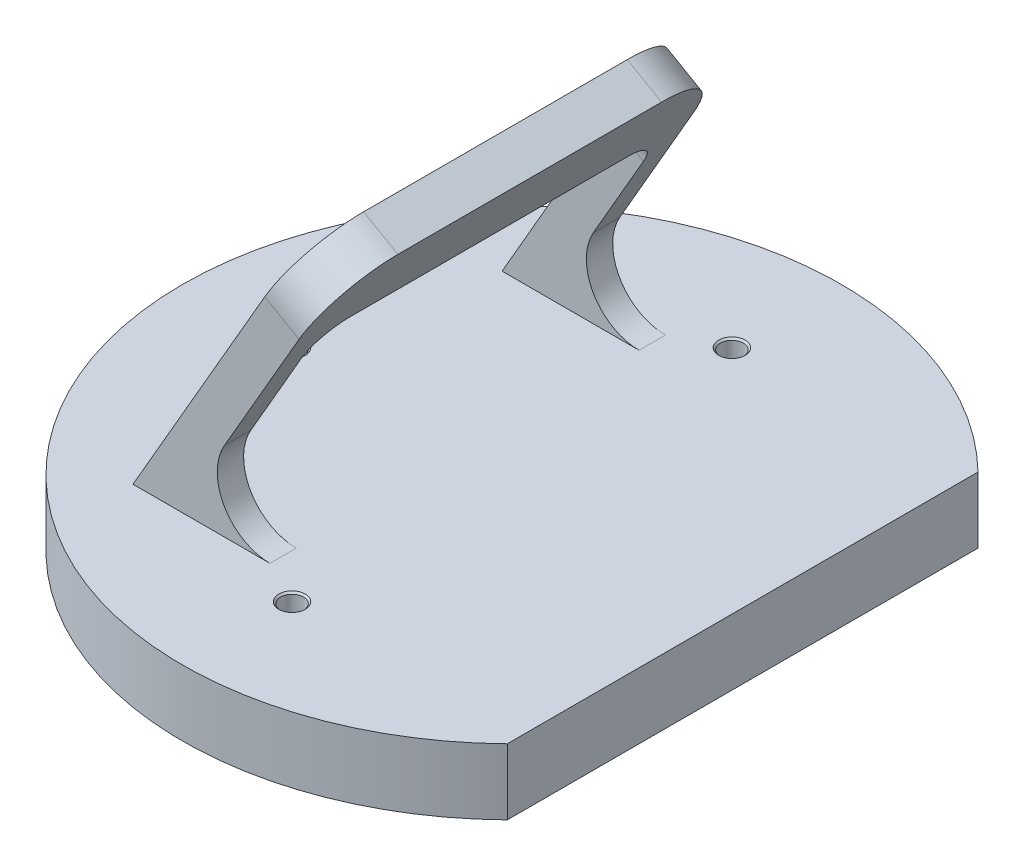
ISO-10303-21;
HEADER;
FILE_DESCRIPTION(('STEP AP214'),'2;1');
FILE_NAME('part.step','',(''),(''),'','','');
FILE_SCHEMA(('AUTOMOTIVE_DESIGN { 1 0 10303 214 1 1 1 1 }'));
ENDSEC;
DATA;
#1=APPLICATION_CONTEXT('core data for automotive mechanical design processes');
#2=APPLICATION_PROTOCOL_DEFINITION('international standard','automotive_design',2000,#1);
#3=PRODUCT_CONTEXT('',#1,'mechanical');
#4=PRODUCT('Part','Part','',(#3));
#5=PRODUCT_RELATED_PRODUCT_CATEGORY('part','',(#4));
#6=PRODUCT_DEFINITION_FORMATION('','',#4);
#7=PRODUCT_DEFINITION_CONTEXT('part definition',#1,'design');
#8=PRODUCT_DEFINITION('design','',#6,#7);
#9=PRODUCT_DEFINITION_SHAPE('','',#8);
#10=(LENGTH_UNIT() NAMED_UNIT(*) SI_UNIT(.MILLI.,.METRE.));
#11=(NAMED_UNIT(*) PLANE_ANGLE_UNIT() SI_UNIT($,.RADIAN.));
#12=(NAMED_UNIT(*) SI_UNIT($,.STERADIAN.) SOLID_ANGLE_UNIT());
#13=UNCERTAINTY_MEASURE_WITH_UNIT(LENGTH_MEASURE(1.E-05),#10,'distance_accuracy_value','');
#14=(GEOMETRIC_REPRESENTATION_CONTEXT(3) GLOBAL_UNCERTAINTY_ASSIGNED_CONTEXT((#13)) GLOBAL_UNIT_ASSIGNED_CONTEXT((#10,
#11,#12)) REPRESENTATION_CONTEXT('',''));
#15=CARTESIAN_POINT('',(0.,0.,0.));
#16=DIRECTION('',(0.,0.,1.));
#17=DIRECTION('',(1.,0.,0.));
#18=AXIS2_PLACEMENT_3D('',#15,#16,#17);
#19=CARTESIAN_POINT('',(-13.4307806183468,36.,60.));
#20=DIRECTION('',(0.,0.,-1.));
#21=DIRECTION('',(-1.,0.,0.));
#22=AXIS2_PLACEMENT_3D('',#19,#20,#21);
#23=CYLINDRICAL_SURFACE('',#22,16.);
#24=DIRECTION('',(0.,0.,-1.));
#25=VECTOR('',#24,1.);
#26=CARTESIAN_POINT('',(-27.2871870788977,44.0000000000001,60.));
#27=LINE('',#26,#25);
#28=CARTESIAN_POINT('',(-27.2871870788977,44.0000000000001,60.));
#29=VERTEX_POINT('',#28);
#30=CARTESIAN_POINT('',(-27.2871870788977,44.0000000000001,52.));
#31=VERTEX_POINT('',#30);
#32=EDGE_CURVE('E259',#29,#31,#27,.T.);
#33=ORIENTED_EDGE('',*,*,#32,.F.);
#34=CARTESIAN_POINT('',(-13.4307806183468,36.,60.));
#35=DIRECTION('',(0.,0.,-1.));
#36=DIRECTION('',(-1.,0.,0.));
#37=AXIS2_PLACEMENT_3D('',#34,#35,#36);
#38=CIRCLE('',#37,16.);
#39=CARTESIAN_POINT('',(-13.4307806183468,20.,60.));
#40=VERTEX_POINT('',#39);
#41=EDGE_CURVE('E50',#29,#40,#38,.F.);
#42=ORIENTED_EDGE('',*,*,#41,.T.);
#43=DIRECTION('',(0.,0.,-1.));
#44=VECTOR('',#43,1.);
#45=CARTESIAN_POINT('',(-13.4307806183468,20.,0.));
#46=LINE('',#45,#44);
#47=CARTESIAN_POINT('',(-13.4307806183468,20.,52.));
#48=VERTEX_POINT('',#47);
#49=EDGE_CURVE('E262',#48,#40,#46,.F.);
#50=ORIENTED_EDGE('',*,*,#49,.F.);
#51=CARTESIAN_POINT('',(-13.4307806183468,36.,52.));
#52=DIRECTION('',(0.,0.,1.));
#53=DIRECTION('',(1.,0.,0.));
#54=AXIS2_PLACEMENT_3D('',#51,#52,#53);
#55=CIRCLE('',#54,16.);
#56=EDGE_CURVE('E11',#48,#31,#55,.F.);
#57=ORIENTED_EDGE('',*,*,#56,.T.);
#58=EDGE_LOOP('',(#33,#42,#50,#57));
#59=FACE_BOUND('',#58,.T.);
#60=ADVANCED_FACE('F43',(#59),#23,.F.);
#61=CARTESIAN_POINT('',(-13.4307806183468,36.,60.));
#62=DIRECTION('',(0.,0.,-1.));
#63=DIRECTION('',(-1.,0.,0.));
#64=AXIS2_PLACEMENT_3D('',#61,#62,#63);
#65=CYLINDRICAL_SURFACE('',#64,16.);
#66=DIRECTION('',(0.,0.,-1.));
#67=VECTOR('',#66,1.);
#68=CARTESIAN_POINT('',(-27.2871870788977,44.0000000000001,60.));
#69=LINE('',#68,#67);
#70=CARTESIAN_POINT('',(-27.2871870788977,44.0000000000001,-52.));
#71=VERTEX_POINT('',#70);
#72=CARTESIAN_POINT('',(-27.2871870788977,44.0000000000001,-60.));
#73=VERTEX_POINT('',#72);
#74=EDGE_CURVE('E251',#71,#73,#69,.T.);
#75=ORIENTED_EDGE('',*,*,#74,.F.);
#76=CARTESIAN_POINT('',(-13.4307806183468,36.,-52.));
#77=DIRECTION('',(0.,0.,1.));
#78=DIRECTION('',(1.,0.,0.));
#79=AXIS2_PLACEMENT_3D('',#76,#77,#78);
#80=CIRCLE('',#79,16.);
#81=CARTESIAN_POINT('',(-13.4307806183468,20.,-52.));
#82=VERTEX_POINT('',#81);
#83=EDGE_CURVE('E255',#71,#82,#80,.T.);
#84=ORIENTED_EDGE('',*,*,#83,.T.);
#85=DIRECTION('',(0.,0.,-1.));
#86=VECTOR('',#85,1.);
#87=CARTESIAN_POINT('',(-13.4307806183468,20.,0.));
#88=LINE('',#87,#86);
#89=CARTESIAN_POINT('',(-13.4307806183468,20.,-60.));
#90=VERTEX_POINT('',#89);
#91=EDGE_CURVE('E173',#90,#82,#88,.F.);
#92=ORIENTED_EDGE('',*,*,#91,.F.);
#93=CARTESIAN_POINT('',(-13.4307806183468,36.,-60.));
#94=DIRECTION('',(0.,0.,-1.));
#95=DIRECTION('',(-1.,0.,0.));
#96=AXIS2_PLACEMENT_3D('',#93,#94,#95);
#97=CIRCLE('',#96,16.);
#98=EDGE_CURVE('E257',#90,#73,#97,.T.);
#99=ORIENTED_EDGE('',*,*,#98,.T.);
#100=EDGE_LOOP('',(#75,#84,#92,#99));
#101=FACE_BOUND('',#100,.T.);
#102=ADVANCED_FACE('F363',(#101),#65,.F.);
#103=CARTESIAN_POINT('',(-44.6076951545868,14.,60.));
#104=DIRECTION('',(-0.866025403784436,0.500000000000004,0.));
#105=DIRECTION('',(-0.500000000000004,-0.866025403784436,0.));
#106=AXIS2_PLACEMENT_3D('',#103,#104,#105);
#107=PLANE('',#106);
#108=DIRECTION('',(0.500000000000004,0.866025403784436,0.));
#109=VECTOR('',#108,1.);
#110=CARTESIAN_POINT('',(-44.6076951545868,14.,60.));
#111=LINE('',#110,#109);
#112=CARTESIAN_POINT('',(-4.60769515458641,83.2820323027549,60.));
#113=VERTEX_POINT('',#112);
#114=EDGE_CURVE('E186',#29,#113,#111,.T.);
#115=ORIENTED_EDGE('',*,*,#114,.F.);
#116=ORIENTED_EDGE('',*,*,#32,.T.);
#117=DIRECTION('',(0.500000000000004,0.866025403784436,0.));
#118=VECTOR('',#117,1.);
#119=CARTESIAN_POINT('',(-41.143593539449,20.,52.));
#120=LINE('',#119,#118);
#121=CARTESIAN_POINT('',(-12.1076951545865,70.2916512459883,52.));
#122=VERTEX_POINT('',#121);
#123=EDGE_CURVE('E165',#31,#122,#120,.T.);
#124=ORIENTED_EDGE('',*,*,#123,.T.);
#125=CARTESIAN_POINT('',(-12.1076951545865,70.2916512459883,42.));
#126=DIRECTION('',(-0.866025403784436,0.500000000000004,0.));
#127=DIRECTION('',(-0.500000000000004,-0.866025403784436,0.));
#128=AXIS2_PLACEMENT_3D('',#125,#126,#127);
#129=CIRCLE('',#128,10.);
#130=CARTESIAN_POINT('',(-7.10769515458647,78.9519052838327,42.));
#131=VERTEX_POINT('',#130);
#132=EDGE_CURVE('E244',#122,#131,#129,.T.);
#133=ORIENTED_EDGE('',*,*,#132,.T.);
#134=DIRECTION('',(0.,0.,1.));
#135=VECTOR('',#134,1.);
#136=CARTESIAN_POINT('',(-7.10769515458647,78.9519052838327,-52.));
#137=LINE('',#136,#135);
#138=CARTESIAN_POINT('',(-7.10769515458647,78.9519052838327,-42.));
#139=VERTEX_POINT('',#138);
#140=EDGE_CURVE('E296',#139,#131,#137,.T.);
#141=ORIENTED_EDGE('',*,*,#140,.F.);
#142=CARTESIAN_POINT('',(-12.1076951545865,70.2916512459883,-42.));
#143=DIRECTION('',(-0.866025403784436,0.500000000000004,0.));
#144=DIRECTION('',(-0.500000000000004,-0.866025403784436,0.));
#145=AXIS2_PLACEMENT_3D('',#142,#143,#144);
#146=CIRCLE('',#145,10.);
#147=CARTESIAN_POINT('',(-12.1076951545865,70.2916512459883,-52.));
#148=VERTEX_POINT('',#147);
#149=EDGE_CURVE('E248',#139,#148,#146,.T.);
#150=ORIENTED_EDGE('',*,*,#149,.T.);
#151=DIRECTION('',(0.500000000000004,0.866025403784436,0.));
#152=VECTOR('',#151,1.);
#153=CARTESIAN_POINT('',(-41.143593539449,20.,-52.));
#154=LINE('',#153,#152);
#155=EDGE_CURVE('E174',#71,#148,#154,.T.);
#156=ORIENTED_EDGE('',*,*,#155,.F.);
#157=ORIENTED_EDGE('',*,*,#74,.T.);
#158=DIRECTION('',(0.500000000000004,0.866025403784436,0.));
#159=VECTOR('',#158,1.);
#160=CARTESIAN_POINT('',(-44.6076951545868,14.,-60.));
#161=LINE('',#160,#159);
#162=CARTESIAN_POINT('',(-4.6076951545864,83.2820323027549,-60.));
#163=VERTEX_POINT('',#162);
#164=EDGE_CURVE('E291',#73,#163,#161,.T.);
#165=ORIENTED_EDGE('',*,*,#164,.T.);
#166=CARTESIAN_POINT('',(-4.60769515458642,83.2820323027549,-40.));
#167=DIRECTION('',(-0.866025403784436,0.500000000000004,0.));
#168=DIRECTION('',(-0.500000000000004,-0.866025403784436,0.));
#169=AXIS2_PLACEMENT_3D('',#166,#167,#168);
#170=CIRCLE('',#169,20.);
#171=CARTESIAN_POINT('',(5.39230484541366,100.602540378444,-40.));
#172=VERTEX_POINT('',#171);
#173=EDGE_CURVE('E220',#163,#172,#170,.F.);
#174=ORIENTED_EDGE('',*,*,#173,.T.);
#175=DIRECTION('',(0.,0.,-1.));
#176=VECTOR('',#175,1.);
#177=CARTESIAN_POINT('',(5.39230484541366,100.602540378444,60.));
#178=LINE('',#177,#176);
#179=CARTESIAN_POINT('',(5.39230484541366,100.602540378444,40.));
#180=VERTEX_POINT('',#179);
#181=EDGE_CURVE('E192',#180,#172,#178,.T.);
#182=ORIENTED_EDGE('',*,*,#181,.F.);
#183=CARTESIAN_POINT('',(-4.60769515458642,83.2820323027549,40.));
#184=DIRECTION('',(-0.866025403784436,0.500000000000004,0.));
#185=DIRECTION('',(-0.500000000000004,-0.866025403784436,0.));
#186=AXIS2_PLACEMENT_3D('',#183,#184,#185);
#187=CIRCLE('',#186,20.);
#188=EDGE_CURVE('E217',#180,#113,#187,.F.);
#189=ORIENTED_EDGE('',*,*,#188,.T.);
#190=EDGE_LOOP('',(#115,#116,#124,#133,#141,#150,#156,#157,#165,#174,#182,#189));
#191=FACE_BOUND('',#190,.T.);
#192=ADVANCED_FACE('F369',(#191),#107,.F.);
#193=CARTESIAN_POINT('',(-55.,20.,60.));
#194=DIRECTION('',(-0.866025403784436,0.500000000000004,0.));
#195=DIRECTION('',(-0.500000000000004,-0.866025403784436,0.));
#196=AXIS2_PLACEMENT_3D('',#193,#194,#195);
#197=PLANE('',#196);
#198=DIRECTION('',(0.,0.,-1.));
#199=VECTOR('',#198,1.);
#200=CARTESIAN_POINT('',(-4.99999999999959,106.602540378444,60.));
#201=LINE('',#200,#199);
#202=CARTESIAN_POINT('',(-4.99999999999959,106.602540378444,40.));
#203=VERTEX_POINT('',#202);
#204=CARTESIAN_POINT('',(-4.99999999999959,106.602540378444,-40.));
#205=VERTEX_POINT('',#204);
#206=EDGE_CURVE('E184',#203,#205,#201,.T.);
#207=ORIENTED_EDGE('',*,*,#206,.T.);
#208=CARTESIAN_POINT('',(-14.9999999999997,89.2820323027549,-40.));
#209=DIRECTION('',(-0.866025403784436,0.500000000000004,0.));
#210=DIRECTION('',(-0.500000000000004,-0.866025403784436,0.));
#211=AXIS2_PLACEMENT_3D('',#208,#209,#210);
#212=CIRCLE('',#211,20.);
#213=CARTESIAN_POINT('',(-14.9999999999997,89.2820323027549,-60.));
#214=VERTEX_POINT('',#213);
#215=EDGE_CURVE('E229',#205,#214,#212,.T.);
#216=ORIENTED_EDGE('',*,*,#215,.T.);
#217=DIRECTION('',(0.500000000000004,0.866025403784436,0.));
#218=VECTOR('',#217,1.);
#219=CARTESIAN_POINT('',(-55.,20.,-60.));
#220=LINE('',#219,#218);
#221=CARTESIAN_POINT('',(-55.,20.,-60.));
#222=VERTEX_POINT('',#221);
#223=EDGE_CURVE('E180',#222,#214,#220,.T.);
#224=ORIENTED_EDGE('',*,*,#223,.F.);
#225=DIRECTION('',(0.,0.,-1.));
#226=VECTOR('',#225,1.);
#227=CARTESIAN_POINT('',(-55.,20.,60.));
#228=LINE('',#227,#226);
#229=CARTESIAN_POINT('',(-55.,20.,-52.));
#230=VERTEX_POINT('',#229);
#231=EDGE_CURVE('E170',#230,#222,#228,.T.);
#232=ORIENTED_EDGE('',*,*,#231,.F.);
#233=DIRECTION('',(-0.500000000000004,-0.866025403784436,0.));
#234=VECTOR('',#233,1.);
#235=CARTESIAN_POINT('',(-17.4999999999997,84.9519052838327,-52.));
#236=LINE('',#235,#234);
#237=CARTESIAN_POINT('',(-22.4999999999997,76.2916512459884,-52.));
#238=VERTEX_POINT('',#237);
#239=EDGE_CURVE('E156',#238,#230,#236,.T.);
#240=ORIENTED_EDGE('',*,*,#239,.F.);
#241=CARTESIAN_POINT('',(-22.4999999999997,76.2916512459884,-42.));
#242=DIRECTION('',(-0.866025403784436,0.500000000000004,0.));
#243=DIRECTION('',(-0.500000000000004,-0.866025403784436,0.));
#244=AXIS2_PLACEMENT_3D('',#241,#242,#243);
#245=CIRCLE('',#244,10.);
#246=CARTESIAN_POINT('',(-17.4999999999997,84.9519052838327,-42.));
#247=VERTEX_POINT('',#246);
#248=EDGE_CURVE('E246',#238,#247,#245,.F.);
#249=ORIENTED_EDGE('',*,*,#248,.T.);
#250=DIRECTION('',(0.,0.,1.));
#251=VECTOR('',#250,1.);
#252=CARTESIAN_POINT('',(-17.4999999999997,84.9519052838327,-52.));
#253=LINE('',#252,#251);
#254=CARTESIAN_POINT('',(-17.4999999999997,84.9519052838327,42.));
#255=VERTEX_POINT('',#254);
#256=EDGE_CURVE('E293',#247,#255,#253,.T.);
#257=ORIENTED_EDGE('',*,*,#256,.T.);
#258=CARTESIAN_POINT('',(-22.4999999999997,76.2916512459884,42.));
#259=DIRECTION('',(-0.866025403784436,0.500000000000004,0.));
#260=DIRECTION('',(-0.500000000000004,-0.866025403784436,0.));
#261=AXIS2_PLACEMENT_3D('',#258,#259,#260);
#262=CIRCLE('',#261,10.);
#263=CARTESIAN_POINT('',(-22.4999999999997,76.2916512459884,52.));
#264=VERTEX_POINT('',#263);
#265=EDGE_CURVE('E242',#255,#264,#262,.F.);
#266=ORIENTED_EDGE('',*,*,#265,.T.);
#267=DIRECTION('',(-0.500000000000004,-0.866025403784436,0.));
#268=VECTOR('',#267,1.);
#269=CARTESIAN_POINT('',(-17.4999999999997,84.9519052838327,52.));
#270=LINE('',#269,#268);
#271=CARTESIAN_POINT('',(-55.,20.,52.));
#272=VERTEX_POINT('',#271);
#273=EDGE_CURVE('E271',#264,#272,#270,.T.);
#274=ORIENTED_EDGE('',*,*,#273,.T.);
#275=CARTESIAN_POINT('',(-55.,20.,60.));
#276=VERTEX_POINT('',#275);
#277=EDGE_CURVE('E181',#276,#272,#228,.T.);
#278=ORIENTED_EDGE('',*,*,#277,.F.);
#279=DIRECTION('',(0.500000000000004,0.866025403784436,0.));
#280=VECTOR('',#279,1.);
#281=CARTESIAN_POINT('',(-55.,20.,60.));
#282=LINE('',#281,#280);
#283=CARTESIAN_POINT('',(-14.9999999999997,89.2820323027549,60.));
#284=VERTEX_POINT('',#283);
#285=EDGE_CURVE('E182',#276,#284,#282,.T.);
#286=ORIENTED_EDGE('',*,*,#285,.T.);
#287=CARTESIAN_POINT('',(-14.9999999999997,89.2820323027549,40.));
#288=DIRECTION('',(-0.866025403784436,0.500000000000004,0.));
#289=DIRECTION('',(-0.500000000000004,-0.866025403784436,0.));
#290=AXIS2_PLACEMENT_3D('',#287,#288,#289);
#291=CIRCLE('',#290,20.);
#292=EDGE_CURVE('E227',#284,#203,#291,.T.);
#293=ORIENTED_EDGE('',*,*,#292,.T.);
#294=EDGE_LOOP('',(#207,#216,#224,#232,#240,#249,#257,#266,#274,#278,#286,#293));
#295=FACE_BOUND('',#294,.T.);
#296=ADVANCED_FACE('F178',(#295),#197,.T.);
#297=CARTESIAN_POINT('',(0.,20.,0.));
#298=DIRECTION('',(0.,1.,0.));
#299=DIRECTION('',(0.,0.,1.));
#300=AXIS2_PLACEMENT_3D('',#297,#298,#299);
#301=PLANE('',#300);
#302=CARTESIAN_POINT('',(0.,20.,-66.737936963143));
#303=DIRECTION('',(0.,1.,0.));
#304=DIRECTION('',(0.,0.,1.));
#305=AXIS2_PLACEMENT_3D('',#302,#303,#304);
#306=CIRCLE('',#305,4.025);
#307=CARTESIAN_POINT('',(0.,20.,-62.712936963143));
#308=VERTEX_POINT('',#307);
#309=EDGE_CURVE('E329',#308,#308,#306,.T.);
#310=ORIENTED_EDGE('',*,*,#309,.F.);
#311=EDGE_LOOP('',(#310));
#312=FACE_BOUND('',#311,.T.);
#313=CARTESIAN_POINT('',(0.,20.,66.737936963143));
#314=DIRECTION('',(0.,1.,0.));
#315=DIRECTION('',(0.,0.,1.));
#316=AXIS2_PLACEMENT_3D('',#313,#314,#315);
#317=CIRCLE('',#316,4.025);
#318=CARTESIAN_POINT('',(0.,20.,70.7629369631429));
#319=VERTEX_POINT('',#318);
#320=EDGE_CURVE('E320',#319,#319,#317,.T.);
#321=ORIENTED_EDGE('',*,*,#320,.F.);
#322=EDGE_LOOP('',(#321));
#323=FACE_BOUND('',#322,.T.);
#324=CARTESIAN_POINT('',(-66.737936963143,20.,0.));
#325=DIRECTION('',(0.,1.,0.));
#326=DIRECTION('',(0.,0.,1.));
#327=AXIS2_PLACEMENT_3D('',#324,#325,#326);
#328=CIRCLE('',#327,4.025);
#329=CARTESIAN_POINT('',(-66.737936963143,20.,4.025));
#330=VERTEX_POINT('',#329);
#331=EDGE_CURVE('E311',#330,#330,#328,.T.);
#332=ORIENTED_EDGE('',*,*,#331,.F.);
#333=EDGE_LOOP('',(#332));
#334=FACE_BOUND('',#333,.T.);
#335=ORIENTED_EDGE('',*,*,#49,.T.);
#336=DIRECTION('',(-1.,0.,0.));
#337=VECTOR('',#336,1.);
#338=CARTESIAN_POINT('',(0.,20.,60.));
#339=LINE('',#338,#337);
#340=EDGE_CURVE('E57',#40,#276,#339,.T.);
#341=ORIENTED_EDGE('',*,*,#340,.T.);
#342=ORIENTED_EDGE('',*,*,#277,.T.);
#343=DIRECTION('',(1.,0.,0.));
#344=VECTOR('',#343,1.);
#345=CARTESIAN_POINT('',(-55.,20.,52.));
#346=LINE('',#345,#344);
#347=EDGE_CURVE('E65',#272,#48,#346,.T.);
#348=ORIENTED_EDGE('',*,*,#347,.T.);
#349=EDGE_LOOP('',(#335,#341,#342,#348));
#350=FACE_BOUND('',#349,.T.);
#351=CARTESIAN_POINT('',(0.,20.,0.));
#352=DIRECTION('',(0.,1.,0.));
#353=DIRECTION('',(0.,0.,1.));
#354=AXIS2_PLACEMENT_3D('',#351,#352,#353);
#355=CIRCLE('',#354,100.);
#356=CARTESIAN_POINT('',(70.,20.,-71.4142842854285));
#357=VERTEX_POINT('',#356);
#358=CARTESIAN_POINT('',(70.,20.,71.4142842854285));
#359=VERTEX_POINT('',#358);
#360=EDGE_CURVE('E196',#357,#359,#355,.T.);
#361=ORIENTED_EDGE('',*,*,#360,.T.);
#362=DIRECTION('',(0.,0.,-1.));
#363=VECTOR('',#362,1.);
#364=CARTESIAN_POINT('',(70.,20.,-71.4142842854285));
#365=LINE('',#364,#363);
#366=EDGE_CURVE('E199',#359,#357,#365,.T.);
#367=ORIENTED_EDGE('',*,*,#366,.T.);
#368=EDGE_LOOP('',(#361,#367));
#369=FACE_BOUND('',#368,.T.);
#370=ORIENTED_EDGE('',*,*,#91,.T.);
#371=DIRECTION('',(1.,0.,0.));
#372=VECTOR('',#371,1.);
#373=CARTESIAN_POINT('',(-55.,20.,-52.));
#374=LINE('',#373,#372);
#375=EDGE_CURVE('E159',#230,#82,#374,.T.);
#376=ORIENTED_EDGE('',*,*,#375,.F.);
#377=ORIENTED_EDGE('',*,*,#231,.T.);
#378=DIRECTION('',(-1.,0.,0.));
#379=VECTOR('',#378,1.);
#380=CARTESIAN_POINT('',(0.,20.,-60.));
#381=LINE('',#380,#379);
#382=EDGE_CURVE('E211',#90,#222,#381,.T.);
#383=ORIENTED_EDGE('',*,*,#382,.F.);
#384=EDGE_LOOP('',(#370,#376,#377,#383));
#385=FACE_BOUND('',#384,.T.);
#386=ADVANCED_FACE('F169',(#312,#323,#334,#350,#369,#385),#301,.T.);
#387=CARTESIAN_POINT('',(0.,20.,0.));
#388=DIRECTION('',(0.,-1.,0.));
#389=DIRECTION('',(0.,0.,-1.));
#390=AXIS2_PLACEMENT_3D('',#387,#388,#389);
#391=CYLINDRICAL_SURFACE('',#390,100.);
#392=CARTESIAN_POINT('',(0.,0.,0.));
#393=DIRECTION('',(0.,1.,0.));
#394=DIRECTION('',(0.,0.,1.));
#395=AXIS2_PLACEMENT_3D('',#392,#393,#394);
#396=CIRCLE('',#395,100.);
#397=CARTESIAN_POINT('',(70.,0.,-71.4142842854285));
#398=VERTEX_POINT('',#397);
#399=CARTESIAN_POINT('',(70.,0.,71.4142842854285));
#400=VERTEX_POINT('',#399);
#401=EDGE_CURVE('E195',#398,#400,#396,.T.);
#402=ORIENTED_EDGE('',*,*,#401,.T.);
#403=DIRECTION('',(0.,-1.,0.));
#404=VECTOR('',#403,1.);
#405=CARTESIAN_POINT('',(70.,20.,71.4142842854285));
#406=LINE('',#405,#404);
#407=EDGE_CURVE('E208',#359,#400,#406,.T.);
#408=ORIENTED_EDGE('',*,*,#407,.F.);
#409=ORIENTED_EDGE('',*,*,#360,.F.);
#410=DIRECTION('',(0.,-1.,0.));
#411=VECTOR('',#410,1.);
#412=CARTESIAN_POINT('',(70.,20.,-71.4142842854285));
#413=LINE('',#412,#411);
#414=EDGE_CURVE('E202',#357,#398,#413,.T.);
#415=ORIENTED_EDGE('',*,*,#414,.T.);
#416=EDGE_LOOP('',(#402,#408,#409,#415));
#417=FACE_BOUND('',#416,.T.);
#418=ADVANCED_FACE('F337',(#417),#391,.T.);
#419=CARTESIAN_POINT('',(70.,20.,-71.4142842854285));
#420=DIRECTION('',(-1.,0.,0.));
#421=DIRECTION('',(0.,0.,1.));
#422=AXIS2_PLACEMENT_3D('',#419,#420,#421);
#423=PLANE('',#422);
#424=DIRECTION('',(0.,0.,-1.));
#425=VECTOR('',#424,1.);
#426=CARTESIAN_POINT('',(70.,0.,-71.4142842854285));
#427=LINE('',#426,#425);
#428=EDGE_CURVE('E200',#400,#398,#427,.T.);
#429=ORIENTED_EDGE('',*,*,#428,.T.);
#430=ORIENTED_EDGE('',*,*,#414,.F.);
#431=ORIENTED_EDGE('',*,*,#366,.F.);
#432=ORIENTED_EDGE('',*,*,#407,.T.);
#433=EDGE_LOOP('',(#429,#430,#431,#432));
#434=FACE_BOUND('',#433,.T.);
#435=ADVANCED_FACE('F391',(#434),#423,.F.);
#436=CARTESIAN_POINT('',(0.,0.,0.));
#437=DIRECTION('',(0.,1.,0.));
#438=DIRECTION('',(0.,0.,1.));
#439=AXIS2_PLACEMENT_3D('',#436,#437,#438);
#440=PLANE('',#439);
#441=CARTESIAN_POINT('',(0.,0.,-66.737936963143));
#442=DIRECTION('',(0.,1.,0.));
#443=DIRECTION('',(0.,0.,1.));
#444=AXIS2_PLACEMENT_3D('',#441,#442,#443);
#445=CIRCLE('',#444,3.5);
#446=CARTESIAN_POINT('',(0.,0.,-63.2379369631429));
#447=VERTEX_POINT('',#446);
#448=EDGE_CURVE('E323',#447,#447,#445,.T.);
#449=ORIENTED_EDGE('',*,*,#448,.T.);
#450=EDGE_LOOP('',(#449));
#451=FACE_BOUND('',#450,.T.);
#452=CARTESIAN_POINT('',(0.,0.,66.737936963143));
#453=DIRECTION('',(0.,1.,0.));
#454=DIRECTION('',(0.,0.,1.));
#455=AXIS2_PLACEMENT_3D('',#452,#453,#454);
#456=CIRCLE('',#455,3.5);
#457=CARTESIAN_POINT('',(0.,0.,70.237936963143));
#458=VERTEX_POINT('',#457);
#459=EDGE_CURVE('E314',#458,#458,#456,.T.);
#460=ORIENTED_EDGE('',*,*,#459,.T.);
#461=EDGE_LOOP('',(#460));
#462=FACE_BOUND('',#461,.T.);
#463=CARTESIAN_POINT('',(-66.737936963143,0.,0.));
#464=DIRECTION('',(0.,1.,0.));
#465=DIRECTION('',(0.,0.,1.));
#466=AXIS2_PLACEMENT_3D('',#463,#464,#465);
#467=CIRCLE('',#466,3.5);
#468=CARTESIAN_POINT('',(-66.737936963143,0.,3.5));
#469=VERTEX_POINT('',#468);
#470=EDGE_CURVE('E304',#469,#469,#467,.T.);
#471=ORIENTED_EDGE('',*,*,#470,.T.);
#472=EDGE_LOOP('',(#471));
#473=FACE_BOUND('',#472,.T.);
#474=ORIENTED_EDGE('',*,*,#401,.F.);
#475=ORIENTED_EDGE('',*,*,#428,.F.);
#476=EDGE_LOOP('',(#474,#475));
#477=FACE_BOUND('',#476,.T.);
#478=ADVANCED_FACE('F395',(#451,#462,#473,#477),#440,.F.);
#479=CARTESIAN_POINT('',(-4.99999999999959,106.602540378444,60.));
#480=DIRECTION('',(0.500000000000002,0.866025403784438,0.));
#481=DIRECTION('',(-0.866025403784438,0.500000000000002,0.));
#482=AXIS2_PLACEMENT_3D('',#479,#480,#481);
#483=PLANE('',#482);
#484=ORIENTED_EDGE('',*,*,#181,.T.);
#485=DIRECTION('',(0.866025403784438,-0.500000000000002,0.));
#486=VECTOR('',#485,1.);
#487=CARTESIAN_POINT('',(-4.99999999999959,106.602540378444,-40.));
#488=LINE('',#487,#486);
#489=EDGE_CURVE('E225',#172,#205,#488,.F.);
#490=ORIENTED_EDGE('',*,*,#489,.T.);
#491=ORIENTED_EDGE('',*,*,#206,.F.);
#492=DIRECTION('',(0.866025403784438,-0.500000000000002,0.));
#493=VECTOR('',#492,1.);
#494=CARTESIAN_POINT('',(5.39230484541367,100.602540378444,40.));
#495=LINE('',#494,#493);
#496=EDGE_CURVE('E222',#203,#180,#495,.T.);
#497=ORIENTED_EDGE('',*,*,#496,.T.);
#498=EDGE_LOOP('',(#484,#490,#491,#497));
#499=FACE_BOUND('',#498,.T.);
#500=ADVANCED_FACE('F280',(#499),#483,.T.);
#501=CARTESIAN_POINT('',(0.,0.,60.));
#502=DIRECTION('',(0.,0.,-1.));
#503=DIRECTION('',(-1.,0.,0.));
#504=AXIS2_PLACEMENT_3D('',#501,#502,#503);
#505=PLANE('',#504);
#506=ORIENTED_EDGE('',*,*,#340,.F.);
#507=ORIENTED_EDGE('',*,*,#41,.F.);
#508=ORIENTED_EDGE('',*,*,#114,.T.);
#509=DIRECTION('',(0.866025403784438,-0.500000000000002,0.));
#510=VECTOR('',#509,1.);
#511=CARTESIAN_POINT('',(-14.9999999999996,89.2820323027549,60.));
#512=LINE('',#511,#510);
#513=EDGE_CURVE('E231',#113,#284,#512,.F.);
#514=ORIENTED_EDGE('',*,*,#513,.T.);
#515=ORIENTED_EDGE('',*,*,#285,.F.);
#516=EDGE_LOOP('',(#506,#507,#508,#514,#515));
#517=FACE_BOUND('',#516,.T.);
#518=ADVANCED_FACE('F272',(#517),#505,.F.);
#519=CARTESIAN_POINT('',(0.,0.,-60.));
#520=DIRECTION('',(0.,0.,-1.));
#521=DIRECTION('',(-1.,0.,0.));
#522=AXIS2_PLACEMENT_3D('',#519,#520,#521);
#523=PLANE('',#522);
#524=ORIENTED_EDGE('',*,*,#223,.T.);
#525=DIRECTION('',(0.866025403784438,-0.500000000000002,0.));
#526=VECTOR('',#525,1.);
#527=CARTESIAN_POINT('',(34.9102540378445,60.4663336986829,-60.));
#528=LINE('',#527,#526);
#529=EDGE_CURVE('E214',#214,#163,#528,.T.);
#530=ORIENTED_EDGE('',*,*,#529,.T.);
#531=ORIENTED_EDGE('',*,*,#164,.F.);
#532=ORIENTED_EDGE('',*,*,#98,.F.);
#533=ORIENTED_EDGE('',*,*,#382,.T.);
#534=EDGE_LOOP('',(#524,#530,#531,#532,#533));
#535=FACE_BOUND('',#534,.T.);
#536=ADVANCED_FACE('F288',(#535),#523,.T.);
#537=CARTESIAN_POINT('',(-17.4999999999997,84.9519052838327,-52.));
#538=DIRECTION('',(0.500000000000004,0.866025403784436,0.));
#539=DIRECTION('',(-0.866025403784436,0.500000000000004,0.));
#540=AXIS2_PLACEMENT_3D('',#537,#538,#539);
#541=PLANE('',#540);
#542=ORIENTED_EDGE('',*,*,#140,.T.);
#543=DIRECTION('',(-0.866025403784436,0.500000000000004,0.));
#544=VECTOR('',#543,1.);
#545=CARTESIAN_POINT('',(-17.4999999999997,84.9519052838327,42.));
#546=LINE('',#545,#544);
#547=EDGE_CURVE('E235',#131,#255,#546,.T.);
#548=ORIENTED_EDGE('',*,*,#547,.T.);
#549=ORIENTED_EDGE('',*,*,#256,.F.);
#550=DIRECTION('',(-0.866025403784436,0.500000000000004,0.));
#551=VECTOR('',#550,1.);
#552=CARTESIAN_POINT('',(-17.4999999999997,84.9519052838327,-42.));
#553=LINE('',#552,#551);
#554=EDGE_CURVE('E233',#247,#139,#553,.F.);
#555=ORIENTED_EDGE('',*,*,#554,.T.);
#556=EDGE_LOOP('',(#542,#548,#549,#555));
#557=FACE_BOUND('',#556,.T.);
#558=ADVANCED_FACE('F405',(#557),#541,.F.);
#559=CARTESIAN_POINT('',(0.,0.,-52.));
#560=DIRECTION('',(0.,0.,1.));
#561=DIRECTION('',(1.,0.,0.));
#562=AXIS2_PLACEMENT_3D('',#559,#560,#561);
#563=PLANE('',#562);
#564=ORIENTED_EDGE('',*,*,#375,.T.);
#565=ORIENTED_EDGE('',*,*,#83,.F.);
#566=ORIENTED_EDGE('',*,*,#155,.T.);
#567=DIRECTION('',(-0.866025403784436,0.500000000000004,0.));
#568=VECTOR('',#567,1.);
#569=CARTESIAN_POINT('',(27.4102540378445,47.4759526419161,-52.));
#570=LINE('',#569,#568);
#571=EDGE_CURVE('E162',#148,#238,#570,.T.);
#572=ORIENTED_EDGE('',*,*,#571,.T.);
#573=ORIENTED_EDGE('',*,*,#239,.T.);
#574=EDGE_LOOP('',(#564,#565,#566,#572,#573));
#575=FACE_BOUND('',#574,.T.);
#576=ADVANCED_FACE('F158',(#575),#563,.T.);
#577=CARTESIAN_POINT('',(0.,0.,52.));
#578=DIRECTION('',(0.,0.,1.));
#579=DIRECTION('',(1.,0.,0.));
#580=AXIS2_PLACEMENT_3D('',#577,#578,#579);
#581=PLANE('',#580);
#582=ORIENTED_EDGE('',*,*,#273,.F.);
#583=DIRECTION('',(-0.866025403784436,0.500000000000004,0.));
#584=VECTOR('',#583,1.);
#585=CARTESIAN_POINT('',(-12.1076951545865,70.2916512459883,52.));
#586=LINE('',#585,#584);
#587=EDGE_CURVE('E238',#264,#122,#586,.F.);
#588=ORIENTED_EDGE('',*,*,#587,.T.);
#589=ORIENTED_EDGE('',*,*,#123,.F.);
#590=ORIENTED_EDGE('',*,*,#56,.F.);
#591=ORIENTED_EDGE('',*,*,#347,.F.);
#592=EDGE_LOOP('',(#582,#588,#589,#590,#591));
#593=FACE_BOUND('',#592,.T.);
#594=ADVANCED_FACE('F388',(#593),#581,.F.);
#595=CARTESIAN_POINT('',(34.9102540378445,60.4663336986829,-40.));
#596=DIRECTION('',(0.866025403784438,-0.500000000000002,0.));
#597=DIRECTION('',(0.500000000000002,0.866025403784438,0.));
#598=AXIS2_PLACEMENT_3D('',#595,#596,#597);
#599=CYLINDRICAL_SURFACE('',#598,20.);
#600=ORIENTED_EDGE('',*,*,#215,.F.);
#601=ORIENTED_EDGE('',*,*,#489,.F.);
#602=ORIENTED_EDGE('',*,*,#173,.F.);
#603=ORIENTED_EDGE('',*,*,#529,.F.);
#604=EDGE_LOOP('',(#600,#601,#602,#603));
#605=FACE_BOUND('',#604,.T.);
#606=ADVANCED_FACE('F285',(#605),#599,.T.);
#607=CARTESIAN_POINT('',(-14.9999999999996,89.2820323027549,40.));
#608=DIRECTION('',(-0.866025403784438,0.500000000000002,0.));
#609=DIRECTION('',(-0.500000000000002,-0.866025403784438,0.));
#610=AXIS2_PLACEMENT_3D('',#607,#608,#609);
#611=CYLINDRICAL_SURFACE('',#610,20.);
#612=ORIENTED_EDGE('',*,*,#292,.F.);
#613=ORIENTED_EDGE('',*,*,#513,.F.);
#614=ORIENTED_EDGE('',*,*,#188,.F.);
#615=ORIENTED_EDGE('',*,*,#496,.F.);
#616=EDGE_LOOP('',(#612,#613,#614,#615));
#617=FACE_BOUND('',#616,.T.);
#618=ADVANCED_FACE('F275',(#617),#611,.T.);
#619=CARTESIAN_POINT('',(-22.4999999999997,76.2916512459884,42.));
#620=DIRECTION('',(0.866025403784436,-0.500000000000004,0.));
#621=DIRECTION('',(0.500000000000004,0.866025403784436,0.));
#622=AXIS2_PLACEMENT_3D('',#619,#620,#621);
#623=CYLINDRICAL_SURFACE('',#622,10.);
#624=ORIENTED_EDGE('',*,*,#132,.F.);
#625=ORIENTED_EDGE('',*,*,#587,.F.);
#626=ORIENTED_EDGE('',*,*,#265,.F.);
#627=ORIENTED_EDGE('',*,*,#547,.F.);
#628=EDGE_LOOP('',(#624,#625,#626,#627));
#629=FACE_BOUND('',#628,.T.);
#630=ADVANCED_FACE('F379',(#629),#623,.F.);
#631=CARTESIAN_POINT('',(27.4102540378445,47.4759526419161,-42.));
#632=DIRECTION('',(-0.866025403784436,0.500000000000004,0.));
#633=DIRECTION('',(-0.500000000000004,-0.866025403784436,0.));
#634=AXIS2_PLACEMENT_3D('',#631,#632,#633);
#635=CYLINDRICAL_SURFACE('',#634,10.);
#636=ORIENTED_EDGE('',*,*,#149,.F.);
#637=ORIENTED_EDGE('',*,*,#554,.F.);
#638=ORIENTED_EDGE('',*,*,#248,.F.);
#639=ORIENTED_EDGE('',*,*,#571,.F.);
#640=EDGE_LOOP('',(#636,#637,#638,#639));
#641=FACE_BOUND('',#640,.T.);
#642=ADVANCED_FACE('F358',(#641),#635,.F.);
#643=CARTESIAN_POINT('',(-66.737936963143,20.,0.));
#644=DIRECTION('',(0.,1.,0.));
#645=DIRECTION('',(0.,0.,1.));
#646=AXIS2_PLACEMENT_3D('',#643,#644,#645);
#647=CYLINDRICAL_SURFACE('',#646,3.5);
#648=ORIENTED_EDGE('',*,*,#470,.F.);
#649=EDGE_LOOP('',(#648));
#650=FACE_BOUND('',#649,.T.);
#651=CARTESIAN_POINT('',(-66.737936963143,19.475,0.));
#652=DIRECTION('',(0.,1.,0.));
#653=DIRECTION('',(0.,0.,1.));
#654=AXIS2_PLACEMENT_3D('',#651,#652,#653);
#655=CIRCLE('',#654,3.5);
#656=CARTESIAN_POINT('',(-66.737936963143,19.475,3.5));
#657=VERTEX_POINT('',#656);
#658=EDGE_CURVE('E308',#657,#657,#655,.T.);
#659=ORIENTED_EDGE('',*,*,#658,.T.);
#660=EDGE_LOOP('',(#659));
#661=FACE_BOUND('',#660,.T.);
#662=ADVANCED_FACE('F346',(#650,#661),#647,.F.);
#663=CARTESIAN_POINT('',(-66.737936963143,20.,0.));
#664=DIRECTION('',(0.,1.,0.));
#665=DIRECTION('',(0.,0.,1.));
#666=AXIS2_PLACEMENT_3D('',#663,#664,#665);
#667=CONICAL_SURFACE('',#666,4.025,0.785398163397445);
#668=ORIENTED_EDGE('',*,*,#658,.F.);
#669=EDGE_LOOP('',(#668));
#670=FACE_BOUND('',#669,.T.);
#671=ORIENTED_EDGE('',*,*,#331,.T.);
#672=EDGE_LOOP('',(#671));
#673=FACE_BOUND('',#672,.T.);
#674=ADVANCED_FACE('F343',(#670,#673),#667,.F.);
#675=CARTESIAN_POINT('',(0.,20.,66.737936963143));
#676=DIRECTION('',(0.,1.,0.));
#677=DIRECTION('',(0.,0.,1.));
#678=AXIS2_PLACEMENT_3D('',#675,#676,#677);
#679=CYLINDRICAL_SURFACE('',#678,3.5);
#680=ORIENTED_EDGE('',*,*,#459,.F.);
#681=EDGE_LOOP('',(#680));
#682=FACE_BOUND('',#681,.T.);
#683=CARTESIAN_POINT('',(0.,19.475,66.737936963143));
#684=DIRECTION('',(0.,1.,0.));
#685=DIRECTION('',(0.,0.,1.));
#686=AXIS2_PLACEMENT_3D('',#683,#684,#685);
#687=CIRCLE('',#686,3.5);
#688=CARTESIAN_POINT('',(0.,19.475,70.237936963143));
#689=VERTEX_POINT('',#688);
#690=EDGE_CURVE('E317',#689,#689,#687,.T.);
#691=ORIENTED_EDGE('',*,*,#690,.T.);
#692=EDGE_LOOP('',(#691));
#693=FACE_BOUND('',#692,.T.);
#694=ADVANCED_FACE('F345',(#682,#693),#679,.F.);
#695=CARTESIAN_POINT('',(0.,20.,66.737936963143));
#696=DIRECTION('',(0.,1.,0.));
#697=DIRECTION('',(0.,0.,1.));
#698=AXIS2_PLACEMENT_3D('',#695,#696,#697);
#699=CONICAL_SURFACE('',#698,4.025,0.785398163397448);
#700=ORIENTED_EDGE('',*,*,#690,.F.);
#701=EDGE_LOOP('',(#700));
#702=FACE_BOUND('',#701,.T.);
#703=ORIENTED_EDGE('',*,*,#320,.T.);
#704=EDGE_LOOP('',(#703));
#705=FACE_BOUND('',#704,.T.);
#706=ADVANCED_FACE('F354',(#702,#705),#699,.F.);
#707=CARTESIAN_POINT('',(0.,20.,-66.737936963143));
#708=DIRECTION('',(0.,1.,0.));
#709=DIRECTION('',(0.,0.,1.));
#710=AXIS2_PLACEMENT_3D('',#707,#708,#709);
#711=CYLINDRICAL_SURFACE('',#710,3.5);
#712=ORIENTED_EDGE('',*,*,#448,.F.);
#713=EDGE_LOOP('',(#712));
#714=FACE_BOUND('',#713,.T.);
#715=CARTESIAN_POINT('',(0.,19.475,-66.737936963143));
#716=DIRECTION('',(0.,1.,0.));
#717=DIRECTION('',(0.,0.,1.));
#718=AXIS2_PLACEMENT_3D('',#715,#716,#717);
#719=CIRCLE('',#718,3.5);
#720=CARTESIAN_POINT('',(0.,19.475,-63.2379369631429));
#721=VERTEX_POINT('',#720);
#722=EDGE_CURVE('E326',#721,#721,#719,.T.);
#723=ORIENTED_EDGE('',*,*,#722,.T.);
#724=EDGE_LOOP('',(#723));
#725=FACE_BOUND('',#724,.T.);
#726=ADVANCED_FACE('F499',(#714,#725),#711,.F.);
#727=CARTESIAN_POINT('',(0.,20.,-66.737936963143));
#728=DIRECTION('',(0.,1.,0.));
#729=DIRECTION('',(0.,0.,1.));
#730=AXIS2_PLACEMENT_3D('',#727,#728,#729);
#731=CONICAL_SURFACE('',#730,4.025,0.785398163397448);
#732=ORIENTED_EDGE('',*,*,#722,.F.);
#733=EDGE_LOOP('',(#732));
#734=FACE_BOUND('',#733,.T.);
#735=ORIENTED_EDGE('',*,*,#309,.T.);
#736=EDGE_LOOP('',(#735));
#737=FACE_BOUND('',#736,.T.);
#738=ADVANCED_FACE('F333',(#734,#737),#731,.F.);
#739=CLOSED_SHELL('',(#60,#102,#192,#296,#386,#418,#435,#478,#500,#518,#536,#558,#576,#594,#606,
#618,#630,#642,#662,#674,#694,#706,#726,#738));
#740=MANIFOLD_SOLID_BREP('B2',#739);
#741=ADVANCED_BREP_SHAPE_REPRESENTATION('',(#18,#740),#14);
#742=SHAPE_DEFINITION_REPRESENTATION(#9,#741);
ENDSEC;
END-ISO-10303-21;
